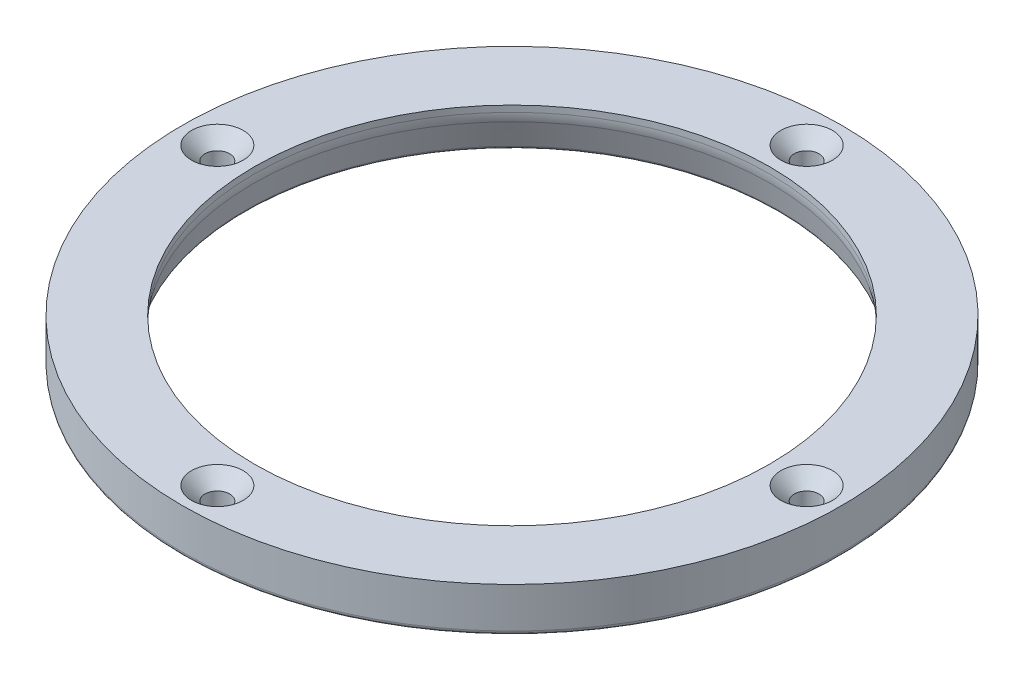
ISO-10303-21;
HEADER;
FILE_DESCRIPTION(('STEP AP214'),'2;1');
FILE_NAME('part.step','',(''),(''),'','','');
FILE_SCHEMA(('AUTOMOTIVE_DESIGN { 1 0 10303 214 1 1 1 1 }'));
ENDSEC;
DATA;
#1=APPLICATION_CONTEXT('core data for automotive mechanical design processes');
#2=APPLICATION_PROTOCOL_DEFINITION('international standard','automotive_design',2000,#1);
#3=PRODUCT_CONTEXT('',#1,'mechanical');
#4=PRODUCT('Part','Part','',(#3));
#5=PRODUCT_RELATED_PRODUCT_CATEGORY('part','',(#4));
#6=PRODUCT_DEFINITION_FORMATION('','',#4);
#7=PRODUCT_DEFINITION_CONTEXT('part definition',#1,'design');
#8=PRODUCT_DEFINITION('design','',#6,#7);
#9=PRODUCT_DEFINITION_SHAPE('','',#8);
#10=(LENGTH_UNIT() NAMED_UNIT(*) SI_UNIT(.MILLI.,.METRE.));
#11=(NAMED_UNIT(*) PLANE_ANGLE_UNIT() SI_UNIT($,.RADIAN.));
#12=(NAMED_UNIT(*) SI_UNIT($,.STERADIAN.) SOLID_ANGLE_UNIT());
#13=UNCERTAINTY_MEASURE_WITH_UNIT(LENGTH_MEASURE(1.E-05),#10,'distance_accuracy_value','');
#14=(GEOMETRIC_REPRESENTATION_CONTEXT(3) GLOBAL_UNCERTAINTY_ASSIGNED_CONTEXT((#13)) GLOBAL_UNIT_ASSIGNED_CONTEXT((#10,
#11,#12)) REPRESENTATION_CONTEXT('',''));
#15=CARTESIAN_POINT('',(0.,0.,0.));
#16=DIRECTION('',(0.,0.,1.));
#17=DIRECTION('',(1.,0.,0.));
#18=AXIS2_PLACEMENT_3D('',#15,#16,#17);
#19=CARTESIAN_POINT('',(0.,8.128,0.));
#20=DIRECTION('',(0.,1.,0.));
#21=DIRECTION('',(0.,0.,1.));
#22=AXIS2_PLACEMENT_3D('',#19,#20,#21);
#23=PLANE('',#22);
#24=CARTESIAN_POINT('',(0.,8.128,0.));
#25=DIRECTION('',(0.,1.,0.));
#26=DIRECTION('',(0.,0.,1.));
#27=AXIS2_PLACEMENT_3D('',#24,#25,#26);
#28=CIRCLE('',#27,46.8652756305866);
#29=CARTESIAN_POINT('',(0.,8.128,46.8652756305866));
#30=VERTEX_POINT('',#29);
#31=EDGE_CURVE('E102',#30,#30,#28,.T.);
#32=ORIENTED_EDGE('',*,*,#31,.F.);
#33=EDGE_LOOP('',(#32));
#34=FACE_BOUND('',#33,.T.);
#35=CARTESIAN_POINT('',(53.594,8.128,-5.61367352621877E-13));
#36=DIRECTION('',(0.,1.,0.));
#37=DIRECTION('',(0.,0.,1.));
#38=AXIS2_PLACEMENT_3D('',#35,#36,#37);
#39=CIRCLE('',#38,4.7);
#40=CARTESIAN_POINT('',(53.594,8.128,4.69999999999944));
#41=VERTEX_POINT('',#40);
#42=EDGE_CURVE('E99',#41,#41,#39,.T.);
#43=ORIENTED_EDGE('',*,*,#42,.F.);
#44=EDGE_LOOP('',(#43));
#45=FACE_BOUND('',#44,.T.);
#46=CARTESIAN_POINT('',(0.,8.128,53.594));
#47=DIRECTION('',(0.,1.,0.));
#48=DIRECTION('',(0.,0.,1.));
#49=AXIS2_PLACEMENT_3D('',#46,#47,#48);
#50=CIRCLE('',#49,4.7);
#51=CARTESIAN_POINT('',(0.,8.128,58.294));
#52=VERTEX_POINT('',#51);
#53=EDGE_CURVE('E90',#52,#52,#50,.T.);
#54=ORIENTED_EDGE('',*,*,#53,.F.);
#55=EDGE_LOOP('',(#54));
#56=FACE_BOUND('',#55,.T.);
#57=CARTESIAN_POINT('',(-53.594,8.128,1.87122450873959E-13));
#58=DIRECTION('',(0.,1.,0.));
#59=DIRECTION('',(0.,0.,1.));
#60=AXIS2_PLACEMENT_3D('',#57,#58,#59);
#61=CIRCLE('',#60,4.7);
#62=CARTESIAN_POINT('',(-53.594,8.128,4.70000000000019));
#63=VERTEX_POINT('',#62);
#64=EDGE_CURVE('E81',#63,#63,#61,.T.);
#65=ORIENTED_EDGE('',*,*,#64,.F.);
#66=EDGE_LOOP('',(#65));
#67=FACE_BOUND('',#66,.T.);
#68=CARTESIAN_POINT('',(0.,8.128,-53.594));
#69=DIRECTION('',(0.,1.,0.));
#70=DIRECTION('',(0.,0.,1.));
#71=AXIS2_PLACEMENT_3D('',#68,#69,#70);
#72=CIRCLE('',#71,4.7);
#73=CARTESIAN_POINT('',(0.,8.128,-48.894));
#74=VERTEX_POINT('',#73);
#75=EDGE_CURVE('E72',#74,#74,#72,.T.);
#76=ORIENTED_EDGE('',*,*,#75,.F.);
#77=EDGE_LOOP('',(#76));
#78=FACE_BOUND('',#77,.T.);
#79=CARTESIAN_POINT('',(0.,8.128,0.));
#80=DIRECTION('',(0.,1.,0.));
#81=DIRECTION('',(0.,0.,1.));
#82=AXIS2_PLACEMENT_3D('',#79,#80,#81);
#83=CIRCLE('',#82,59.944);
#84=CARTESIAN_POINT('',(0.,8.128,59.944));
#85=VERTEX_POINT('',#84);
#86=EDGE_CURVE('E63',#85,#85,#83,.T.);
#87=ORIENTED_EDGE('',*,*,#86,.T.);
#88=EDGE_LOOP('',(#87));
#89=FACE_BOUND('',#88,.T.);
#90=ADVANCED_FACE('F37',(#34,#45,#56,#67,#78,#89),#23,.T.);
#91=CARTESIAN_POINT('',(0.,0.,0.));
#92=DIRECTION('',(0.,1.,0.));
#93=DIRECTION('',(0.,0.,1.));
#94=AXIS2_PLACEMENT_3D('',#91,#92,#93);
#95=PLANE('',#94);
#96=CARTESIAN_POINT('',(0.,0.,0.));
#97=DIRECTION('',(0.,1.,0.));
#98=DIRECTION('',(0.,0.,1.));
#99=AXIS2_PLACEMENT_3D('',#96,#97,#98);
#100=CIRCLE('',#99,59.15025);
#101=CARTESIAN_POINT('',(0.,0.,59.15025));
#102=VERTEX_POINT('',#101);
#103=EDGE_CURVE('E44',#102,#102,#100,.F.);
#104=ORIENTED_EDGE('',*,*,#103,.T.);
#105=EDGE_LOOP('',(#104));
#106=FACE_BOUND('',#105,.T.);
#107=CARTESIAN_POINT('',(0.,0.,0.));
#108=DIRECTION('',(0.,1.,0.));
#109=DIRECTION('',(0.,0.,1.));
#110=AXIS2_PLACEMENT_3D('',#107,#108,#109);
#111=CIRCLE('',#110,49.1230657967083);
#112=CARTESIAN_POINT('',(0.,0.,49.1230657967083));
#113=VERTEX_POINT('',#112);
#114=EDGE_CURVE('E48',#113,#113,#111,.T.);
#115=ORIENTED_EDGE('',*,*,#114,.T.);
#116=EDGE_LOOP('',(#115));
#117=FACE_BOUND('',#116,.T.);
#118=CARTESIAN_POINT('',(53.594,0.,-5.61367352621877E-13));
#119=DIRECTION('',(0.,1.,0.));
#120=DIRECTION('',(0.,0.,1.));
#121=AXIS2_PLACEMENT_3D('',#118,#119,#120);
#122=CIRCLE('',#121,2.25);
#123=CARTESIAN_POINT('',(53.594,0.,2.24999999999944));
#124=VERTEX_POINT('',#123);
#125=EDGE_CURVE('E93',#124,#124,#122,.T.);
#126=ORIENTED_EDGE('',*,*,#125,.T.);
#127=EDGE_LOOP('',(#126));
#128=FACE_BOUND('',#127,.T.);
#129=CARTESIAN_POINT('',(0.,0.,53.594));
#130=DIRECTION('',(0.,1.,0.));
#131=DIRECTION('',(0.,0.,1.));
#132=AXIS2_PLACEMENT_3D('',#129,#130,#131);
#133=CIRCLE('',#132,2.25);
#134=CARTESIAN_POINT('',(0.,0.,55.844));
#135=VERTEX_POINT('',#134);
#136=EDGE_CURVE('E84',#135,#135,#133,.T.);
#137=ORIENTED_EDGE('',*,*,#136,.T.);
#138=EDGE_LOOP('',(#137));
#139=FACE_BOUND('',#138,.T.);
#140=CARTESIAN_POINT('',(-53.594,0.,1.87122450873959E-13));
#141=DIRECTION('',(0.,1.,0.));
#142=DIRECTION('',(0.,0.,1.));
#143=AXIS2_PLACEMENT_3D('',#140,#141,#142);
#144=CIRCLE('',#143,2.25);
#145=CARTESIAN_POINT('',(-53.594,0.,2.25000000000019));
#146=VERTEX_POINT('',#145);
#147=EDGE_CURVE('E75',#146,#146,#144,.T.);
#148=ORIENTED_EDGE('',*,*,#147,.T.);
#149=EDGE_LOOP('',(#148));
#150=FACE_BOUND('',#149,.T.);
#151=CARTESIAN_POINT('',(0.,0.,-53.594));
#152=DIRECTION('',(0.,1.,0.));
#153=DIRECTION('',(0.,0.,1.));
#154=AXIS2_PLACEMENT_3D('',#151,#152,#153);
#155=CIRCLE('',#154,2.25);
#156=CARTESIAN_POINT('',(0.,0.,-51.344));
#157=VERTEX_POINT('',#156);
#158=EDGE_CURVE('E66',#157,#157,#155,.T.);
#159=ORIENTED_EDGE('',*,*,#158,.T.);
#160=EDGE_LOOP('',(#159));
#161=FACE_BOUND('',#160,.T.);
#162=ADVANCED_FACE('F110',(#106,#117,#128,#139,#150,#161),#95,.F.);
#163=CARTESIAN_POINT('',(0.,8.128,0.));
#164=DIRECTION('',(0.,-1.,0.));
#165=DIRECTION('',(0.,0.,-1.));
#166=AXIS2_PLACEMENT_3D('',#163,#164,#165);
#167=CYLINDRICAL_SURFACE('',#166,59.944);
#168=CARTESIAN_POINT('',(0.,0.79375,0.));
#169=DIRECTION('',(0.,1.,0.));
#170=DIRECTION('',(0.,0.,1.));
#171=AXIS2_PLACEMENT_3D('',#168,#169,#170);
#172=CIRCLE('',#171,59.944);
#173=CARTESIAN_POINT('',(0.,0.79375,59.944));
#174=VERTEX_POINT('',#173);
#175=EDGE_CURVE('E52',#174,#174,#172,.T.);
#176=ORIENTED_EDGE('',*,*,#175,.T.);
#177=EDGE_LOOP('',(#176));
#178=FACE_BOUND('',#177,.T.);
#179=ORIENTED_EDGE('',*,*,#86,.F.);
#180=EDGE_LOOP('',(#179));
#181=FACE_BOUND('',#180,.T.);
#182=ADVANCED_FACE('F122',(#178,#181),#167,.T.);
#183=CARTESIAN_POINT('',(0.,8.128,-53.594));
#184=DIRECTION('',(0.,1.,0.));
#185=DIRECTION('',(0.,0.,1.));
#186=AXIS2_PLACEMENT_3D('',#183,#184,#185);
#187=CYLINDRICAL_SURFACE('',#186,2.25);
#188=ORIENTED_EDGE('',*,*,#158,.F.);
#189=EDGE_LOOP('',(#188));
#190=FACE_BOUND('',#189,.T.);
#191=CARTESIAN_POINT('',(0.,5.678,-53.594));
#192=DIRECTION('',(0.,1.,0.));
#193=DIRECTION('',(0.,0.,1.));
#194=AXIS2_PLACEMENT_3D('',#191,#192,#193);
#195=CIRCLE('',#194,2.25);
#196=CARTESIAN_POINT('',(0.,5.678,-51.344));
#197=VERTEX_POINT('',#196);
#198=EDGE_CURVE('E69',#197,#197,#195,.T.);
#199=ORIENTED_EDGE('',*,*,#198,.T.);
#200=EDGE_LOOP('',(#199));
#201=FACE_BOUND('',#200,.T.);
#202=ADVANCED_FACE('F124',(#190,#201),#187,.F.);
#203=CARTESIAN_POINT('',(0.,8.128,-53.594));
#204=DIRECTION('',(0.,1.,0.));
#205=DIRECTION('',(0.,0.,1.));
#206=AXIS2_PLACEMENT_3D('',#203,#204,#205);
#207=CONICAL_SURFACE('',#206,4.7,0.785398163397448);
#208=ORIENTED_EDGE('',*,*,#198,.F.);
#209=EDGE_LOOP('',(#208));
#210=FACE_BOUND('',#209,.T.);
#211=ORIENTED_EDGE('',*,*,#75,.T.);
#212=EDGE_LOOP('',(#211));
#213=FACE_BOUND('',#212,.T.);
#214=ADVANCED_FACE('F132',(#210,#213),#207,.F.);
#215=CARTESIAN_POINT('',(-53.594,8.128,1.87122450873959E-13));
#216=DIRECTION('',(0.,1.,0.));
#217=DIRECTION('',(0.,0.,1.));
#218=AXIS2_PLACEMENT_3D('',#215,#216,#217);
#219=CYLINDRICAL_SURFACE('',#218,2.25);
#220=ORIENTED_EDGE('',*,*,#147,.F.);
#221=EDGE_LOOP('',(#220));
#222=FACE_BOUND('',#221,.T.);
#223=CARTESIAN_POINT('',(-53.594,5.678,1.87122450873959E-13));
#224=DIRECTION('',(0.,1.,0.));
#225=DIRECTION('',(0.,0.,1.));
#226=AXIS2_PLACEMENT_3D('',#223,#224,#225);
#227=CIRCLE('',#226,2.25);
#228=CARTESIAN_POINT('',(-53.594,5.678,2.25000000000019));
#229=VERTEX_POINT('',#228);
#230=EDGE_CURVE('E78',#229,#229,#227,.T.);
#231=ORIENTED_EDGE('',*,*,#230,.T.);
#232=EDGE_LOOP('',(#231));
#233=FACE_BOUND('',#232,.T.);
#234=ADVANCED_FACE('F167',(#222,#233),#219,.F.);
#235=CARTESIAN_POINT('',(-53.594,8.128,1.87122450873959E-13));
#236=DIRECTION('',(0.,1.,0.));
#237=DIRECTION('',(0.,0.,1.));
#238=AXIS2_PLACEMENT_3D('',#235,#236,#237);
#239=CONICAL_SURFACE('',#238,4.7,0.785398163397448);
#240=ORIENTED_EDGE('',*,*,#230,.F.);
#241=EDGE_LOOP('',(#240));
#242=FACE_BOUND('',#241,.T.);
#243=ORIENTED_EDGE('',*,*,#64,.T.);
#244=EDGE_LOOP('',(#243));
#245=FACE_BOUND('',#244,.T.);
#246=ADVANCED_FACE('F172',(#242,#245),#239,.F.);
#247=CARTESIAN_POINT('',(0.,8.128,53.594));
#248=DIRECTION('',(0.,1.,0.));
#249=DIRECTION('',(0.,0.,1.));
#250=AXIS2_PLACEMENT_3D('',#247,#248,#249);
#251=CYLINDRICAL_SURFACE('',#250,2.25);
#252=ORIENTED_EDGE('',*,*,#136,.F.);
#253=EDGE_LOOP('',(#252));
#254=FACE_BOUND('',#253,.T.);
#255=CARTESIAN_POINT('',(0.,5.678,53.594));
#256=DIRECTION('',(0.,1.,0.));
#257=DIRECTION('',(0.,0.,1.));
#258=AXIS2_PLACEMENT_3D('',#255,#256,#257);
#259=CIRCLE('',#258,2.25);
#260=CARTESIAN_POINT('',(0.,5.678,55.844));
#261=VERTEX_POINT('',#260);
#262=EDGE_CURVE('E87',#261,#261,#259,.T.);
#263=ORIENTED_EDGE('',*,*,#262,.T.);
#264=EDGE_LOOP('',(#263));
#265=FACE_BOUND('',#264,.T.);
#266=ADVANCED_FACE('F178',(#254,#265),#251,.F.);
#267=CARTESIAN_POINT('',(0.,8.128,53.594));
#268=DIRECTION('',(0.,1.,0.));
#269=DIRECTION('',(0.,0.,1.));
#270=AXIS2_PLACEMENT_3D('',#267,#268,#269);
#271=CONICAL_SURFACE('',#270,4.7,0.785398163397448);
#272=ORIENTED_EDGE('',*,*,#262,.F.);
#273=EDGE_LOOP('',(#272));
#274=FACE_BOUND('',#273,.T.);
#275=ORIENTED_EDGE('',*,*,#53,.T.);
#276=EDGE_LOOP('',(#275));
#277=FACE_BOUND('',#276,.T.);
#278=ADVANCED_FACE('F182',(#274,#277),#271,.F.);
#279=CARTESIAN_POINT('',(53.594,8.128,-5.61367352621877E-13));
#280=DIRECTION('',(0.,1.,0.));
#281=DIRECTION('',(0.,0.,1.));
#282=AXIS2_PLACEMENT_3D('',#279,#280,#281);
#283=CYLINDRICAL_SURFACE('',#282,2.25);
#284=ORIENTED_EDGE('',*,*,#125,.F.);
#285=EDGE_LOOP('',(#284));
#286=FACE_BOUND('',#285,.T.);
#287=CARTESIAN_POINT('',(53.594,5.678,-5.61367352621877E-13));
#288=DIRECTION('',(0.,1.,0.));
#289=DIRECTION('',(0.,0.,1.));
#290=AXIS2_PLACEMENT_3D('',#287,#288,#289);
#291=CIRCLE('',#290,2.25);
#292=CARTESIAN_POINT('',(53.594,5.678,2.24999999999944));
#293=VERTEX_POINT('',#292);
#294=EDGE_CURVE('E96',#293,#293,#291,.T.);
#295=ORIENTED_EDGE('',*,*,#294,.T.);
#296=EDGE_LOOP('',(#295));
#297=FACE_BOUND('',#296,.T.);
#298=ADVANCED_FACE('F186',(#286,#297),#283,.F.);
#299=CARTESIAN_POINT('',(53.594,8.128,-5.61367352621877E-13));
#300=DIRECTION('',(0.,1.,0.));
#301=DIRECTION('',(0.,0.,1.));
#302=AXIS2_PLACEMENT_3D('',#299,#300,#301);
#303=CONICAL_SURFACE('',#302,4.7,0.785398163397448);
#304=ORIENTED_EDGE('',*,*,#294,.F.);
#305=EDGE_LOOP('',(#304));
#306=FACE_BOUND('',#305,.T.);
#307=ORIENTED_EDGE('',*,*,#42,.T.);
#308=EDGE_LOOP('',(#307));
#309=FACE_BOUND('',#308,.T.);
#310=ADVANCED_FACE('F190',(#306,#309),#303,.F.);
#311=CARTESIAN_POINT('',(0.,0.,0.));
#312=DIRECTION('',(0.,-1.,0.));
#313=DIRECTION('',(0.,0.,-1.));
#314=AXIS2_PLACEMENT_3D('',#311,#312,#313);
#315=CONICAL_SURFACE('',#314,48.514,0.261799387799143);
#316=CARTESIAN_POINT('',(0.,0.588312382949882,0.));
#317=DIRECTION('',(0.,-1.,0.));
#318=DIRECTION('',(0.,0.,-1.));
#319=AXIS2_PLACEMENT_3D('',#316,#317,#318);
#320=CIRCLE('',#319,48.3563621720914);
#321=CARTESIAN_POINT('',(0.,0.588312382949882,-48.3563621720914));
#322=VERTEX_POINT('',#321);
#323=EDGE_CURVE('E10',#322,#322,#320,.T.);
#324=ORIENTED_EDGE('',*,*,#323,.T.);
#325=EDGE_LOOP('',(#324));
#326=FACE_BOUND('',#325,.T.);
#327=CARTESIAN_POINT('',(0.,5.34561553760706,0.));
#328=DIRECTION('',(0.,-1.,0.));
#329=DIRECTION('',(0.,0.,-1.));
#330=AXIS2_PLACEMENT_3D('',#327,#328,#329);
#331=CIRCLE('',#330,47.081646633651);
#332=CARTESIAN_POINT('',(0.,5.34561553760706,-47.081646633651));
#333=VERTEX_POINT('',#332);
#334=EDGE_CURVE('E57',#333,#333,#331,.F.);
#335=ORIENTED_EDGE('',*,*,#334,.T.);
#336=EDGE_LOOP('',(#335));
#337=FACE_BOUND('',#336,.T.);
#338=ADVANCED_FACE('F194',(#326,#337),#315,.F.);
#339=CARTESIAN_POINT('',(0.,0.,0.));
#340=DIRECTION('',(0.,1.,0.));
#341=DIRECTION('',(0.,0.,1.));
#342=AXIS2_PLACEMENT_3D('',#339,#340,#341);
#343=CYLINDRICAL_SURFACE('',#342,46.8652756305866);
#344=CARTESIAN_POINT('',(0.,6.98911647400803,0.));
#345=DIRECTION('',(0.,1.,0.));
#346=DIRECTION('',(0.,0.,1.));
#347=AXIS2_PLACEMENT_3D('',#344,#345,#346);
#348=CIRCLE('',#347,46.8652756305866);
#349=CARTESIAN_POINT('',(0.,6.98911647400803,46.8652756305866));
#350=VERTEX_POINT('',#349);
#351=EDGE_CURVE('E60',#350,#350,#348,.F.);
#352=ORIENTED_EDGE('',*,*,#351,.T.);
#353=EDGE_LOOP('',(#352));
#354=FACE_BOUND('',#353,.T.);
#355=ORIENTED_EDGE('',*,*,#31,.T.);
#356=EDGE_LOOP('',(#355));
#357=FACE_BOUND('',#356,.T.);
#358=ADVANCED_FACE('F106',(#354,#357),#343,.F.);
#359=CARTESIAN_POINT('',(0.,6.98911647400803,0.));
#360=DIRECTION('',(0.,1.,0.));
#361=DIRECTION('',(0.,0.,1.));
#362=AXIS2_PLACEMENT_3D('',#359,#360,#361);
#363=TOROIDAL_SURFACE('',#362,53.2152756305866,6.35);
#364=ORIENTED_EDGE('',*,*,#334,.F.);
#365=EDGE_LOOP('',(#364));
#366=FACE_BOUND('',#365,.T.);
#367=ORIENTED_EDGE('',*,*,#351,.F.);
#368=EDGE_LOOP('',(#367));
#369=FACE_BOUND('',#368,.T.);
#370=ADVANCED_FACE('F137',(#366,#369),#363,.T.);
#371=CARTESIAN_POINT('',(0.,0.79375,0.));
#372=DIRECTION('',(0.,1.,0.));
#373=DIRECTION('',(0.,0.,1.));
#374=AXIS2_PLACEMENT_3D('',#371,#372,#373);
#375=TOROIDAL_SURFACE('',#374,59.15025,0.79375);
#376=ORIENTED_EDGE('',*,*,#103,.F.);
#377=EDGE_LOOP('',(#376));
#378=FACE_BOUND('',#377,.T.);
#379=ORIENTED_EDGE('',*,*,#175,.F.);
#380=EDGE_LOOP('',(#379));
#381=FACE_BOUND('',#380,.T.);
#382=ADVANCED_FACE('F139',(#378,#381),#375,.T.);
#383=CARTESIAN_POINT('',(0.,0.79375,0.));
#384=DIRECTION('',(0.,1.,0.));
#385=DIRECTION('',(0.,0.,1.));
#386=AXIS2_PLACEMENT_3D('',#383,#384,#385);
#387=TOROIDAL_SURFACE('',#386,49.1230657967083,0.79375);
#388=ORIENTED_EDGE('',*,*,#323,.F.);
#389=EDGE_LOOP('',(#388));
#390=FACE_BOUND('',#389,.T.);
#391=ORIENTED_EDGE('',*,*,#114,.F.);
#392=EDGE_LOOP('',(#391));
#393=FACE_BOUND('',#392,.T.);
#394=ADVANCED_FACE('F39',(#390,#393),#387,.T.);
#395=CLOSED_SHELL('',(#90,#162,#182,#202,#214,#234,#246,#266,#278,#298,#310,#338,#358,#370,#382,#394));
#396=MANIFOLD_SOLID_BREP('B2',#395);
#397=ADVANCED_BREP_SHAPE_REPRESENTATION('',(#18,#396),#14);
#398=SHAPE_DEFINITION_REPRESENTATION(#9,#397);
ENDSEC;
END-ISO-10303-21;
